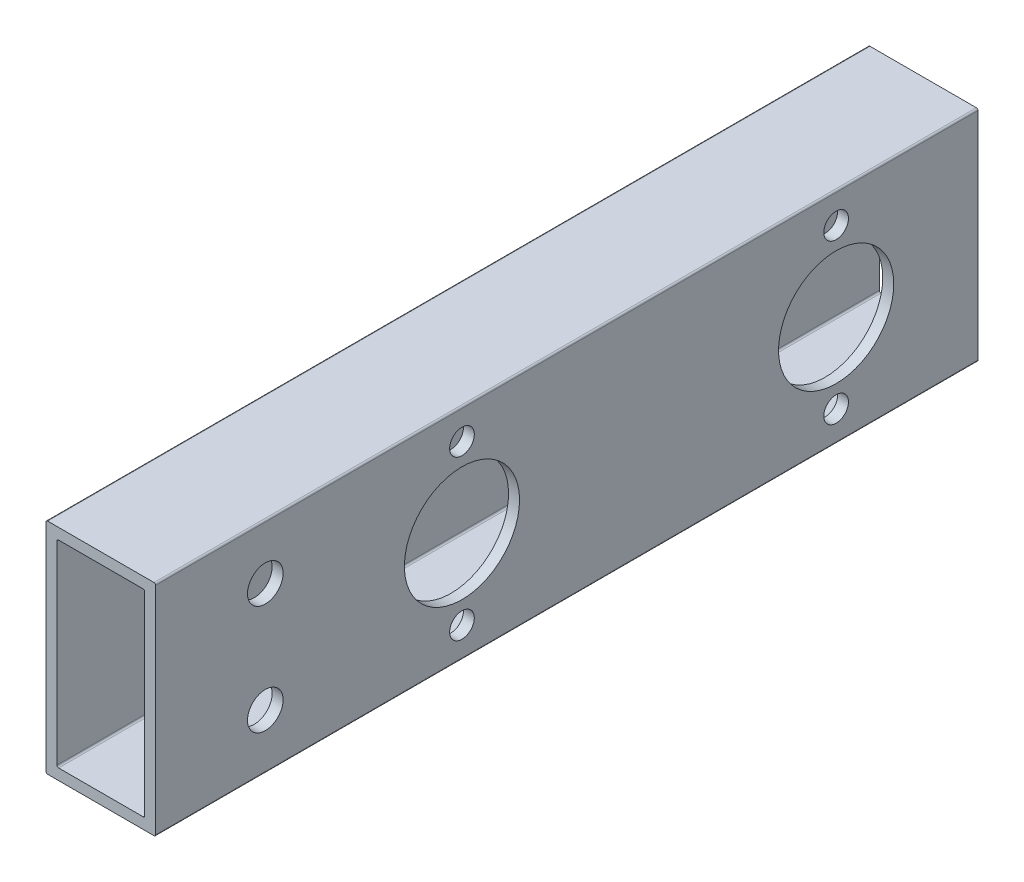
ISO-10303-21;
HEADER;
FILE_DESCRIPTION(('STEP AP214'),'2;1');
FILE_NAME('part.step','',(''),(''),'','','');
FILE_SCHEMA(('AUTOMOTIVE_DESIGN { 1 0 10303 214 1 1 1 1 }'));
ENDSEC;
DATA;
#1=APPLICATION_CONTEXT('core data for automotive mechanical design processes');
#2=APPLICATION_PROTOCOL_DEFINITION('international standard','automotive_design',2000,#1);
#3=PRODUCT_CONTEXT('',#1,'mechanical');
#4=PRODUCT('Part','Part','',(#3));
#5=PRODUCT_RELATED_PRODUCT_CATEGORY('part','',(#4));
#6=PRODUCT_DEFINITION_FORMATION('','',#4);
#7=PRODUCT_DEFINITION_CONTEXT('part definition',#1,'design');
#8=PRODUCT_DEFINITION('design','',#6,#7);
#9=PRODUCT_DEFINITION_SHAPE('','',#8);
#10=(LENGTH_UNIT() NAMED_UNIT(*) SI_UNIT(.MILLI.,.METRE.));
#11=(NAMED_UNIT(*) PLANE_ANGLE_UNIT() SI_UNIT($,.RADIAN.));
#12=(NAMED_UNIT(*) SI_UNIT($,.STERADIAN.) SOLID_ANGLE_UNIT());
#13=UNCERTAINTY_MEASURE_WITH_UNIT(LENGTH_MEASURE(1.E-05),#10,'distance_accuracy_value','');
#14=(GEOMETRIC_REPRESENTATION_CONTEXT(3) GLOBAL_UNCERTAINTY_ASSIGNED_CONTEXT((#13)) GLOBAL_UNIT_ASSIGNED_CONTEXT((#10,
#11,#12)) REPRESENTATION_CONTEXT('',''));
#15=CARTESIAN_POINT('',(0.,0.,0.));
#16=DIRECTION('',(0.,0.,1.));
#17=DIRECTION('',(1.,0.,0.));
#18=AXIS2_PLACEMENT_3D('',#15,#16,#17);
#19=CARTESIAN_POINT('',(0.300000000000001,0.300000000000001,-150.));
#20=DIRECTION('',(0.,0.,1.));
#21=DIRECTION('',(1.,0.,0.));
#22=AXIS2_PLACEMENT_3D('',#19,#20,#21);
#23=CYLINDRICAL_SURFACE('',#22,0.300000000000001);
#24=CARTESIAN_POINT('',(0.300000000000001,0.300000000000001,0.));
#25=DIRECTION('',(0.,0.,1.));
#26=DIRECTION('',(1.,0.,0.));
#27=AXIS2_PLACEMENT_3D('',#24,#25,#26);
#28=CIRCLE('',#27,0.300000000000001);
#29=CARTESIAN_POINT('',(0.,0.3,0.));
#30=VERTEX_POINT('',#29);
#31=CARTESIAN_POINT('',(0.3,0.,0.));
#32=VERTEX_POINT('',#31);
#33=EDGE_CURVE('E206',#30,#32,#28,.T.);
#34=ORIENTED_EDGE('',*,*,#33,.F.);
#35=DIRECTION('',(0.,0.,1.));
#36=VECTOR('',#35,1.);
#37=CARTESIAN_POINT('',(0.,0.3,-150.));
#38=LINE('',#37,#36);
#39=CARTESIAN_POINT('',(0.,0.3,-150.));
#40=VERTEX_POINT('',#39);
#41=EDGE_CURVE('E11',#40,#30,#38,.T.);
#42=ORIENTED_EDGE('',*,*,#41,.F.);
#43=CARTESIAN_POINT('',(0.300000000000001,0.300000000000001,-150.));
#44=DIRECTION('',(0.,0.,1.));
#45=DIRECTION('',(1.,0.,0.));
#46=AXIS2_PLACEMENT_3D('',#43,#44,#45);
#47=CIRCLE('',#46,0.300000000000001);
#48=CARTESIAN_POINT('',(0.3,0.,-150.));
#49=VERTEX_POINT('',#48);
#50=EDGE_CURVE('E218',#40,#49,#47,.T.);
#51=ORIENTED_EDGE('',*,*,#50,.T.);
#52=DIRECTION('',(0.,0.,1.));
#53=VECTOR('',#52,1.);
#54=CARTESIAN_POINT('',(0.3,0.,-150.));
#55=LINE('',#54,#53);
#56=EDGE_CURVE('E243',#49,#32,#55,.T.);
#57=ORIENTED_EDGE('',*,*,#56,.T.);
#58=EDGE_LOOP('',(#34,#42,#51,#57));
#59=FACE_BOUND('',#58,.T.);
#60=ADVANCED_FACE('F33',(#59),#23,.T.);
#61=CARTESIAN_POINT('',(0.,39.7,-150.));
#62=DIRECTION('',(-1.,0.,0.));
#63=DIRECTION('',(0.,0.,1.));
#64=AXIS2_PLACEMENT_3D('',#61,#62,#63);
#65=PLANE('',#64);
#66=CARTESIAN_POINT('',(0.,20.,-55.875));
#67=DIRECTION('',(1.,0.,0.));
#68=DIRECTION('',(0.,0.,-1.));
#69=AXIS2_PLACEMENT_3D('',#66,#67,#68);
#70=CIRCLE('',#69,10.5);
#71=CARTESIAN_POINT('',(0.,20.,-66.375));
#72=VERTEX_POINT('',#71);
#73=EDGE_CURVE('E296',#72,#72,#70,.T.);
#74=ORIENTED_EDGE('',*,*,#73,.T.);
#75=EDGE_LOOP('',(#74));
#76=FACE_BOUND('',#75,.T.);
#77=CARTESIAN_POINT('',(0.,20.,-124.125));
#78=DIRECTION('',(1.,0.,0.));
#79=DIRECTION('',(0.,0.,-1.));
#80=AXIS2_PLACEMENT_3D('',#77,#78,#79);
#81=CIRCLE('',#80,10.5);
#82=CARTESIAN_POINT('',(0.,20.,-134.625));
#83=VERTEX_POINT('',#82);
#84=EDGE_CURVE('E291',#83,#83,#81,.T.);
#85=ORIENTED_EDGE('',*,*,#84,.T.);
#86=EDGE_LOOP('',(#85));
#87=FACE_BOUND('',#86,.T.);
#88=CARTESIAN_POINT('',(0.,10.,-20.));
#89=DIRECTION('',(-1.,0.,0.));
#90=DIRECTION('',(0.,0.,1.));
#91=AXIS2_PLACEMENT_3D('',#88,#89,#90);
#92=CIRCLE('',#91,3.25);
#93=CARTESIAN_POINT('',(0.,10.,-16.75));
#94=VERTEX_POINT('',#93);
#95=EDGE_CURVE('E335',#94,#94,#92,.T.);
#96=ORIENTED_EDGE('',*,*,#95,.F.);
#97=EDGE_LOOP('',(#96));
#98=FACE_BOUND('',#97,.T.);
#99=CARTESIAN_POINT('',(0.,30.,-20.));
#100=DIRECTION('',(-1.,0.,0.));
#101=DIRECTION('',(0.,0.,1.));
#102=AXIS2_PLACEMENT_3D('',#99,#100,#101);
#103=CIRCLE('',#102,3.25);
#104=CARTESIAN_POINT('',(0.,30.,-16.75));
#105=VERTEX_POINT('',#104);
#106=EDGE_CURVE('E342',#105,#105,#103,.T.);
#107=ORIENTED_EDGE('',*,*,#106,.F.);
#108=EDGE_LOOP('',(#107));
#109=FACE_BOUND('',#108,.T.);
#110=DIRECTION('',(0.,-1.,0.));
#111=VECTOR('',#110,1.);
#112=CARTESIAN_POINT('',(0.,39.7,0.));
#113=LINE('',#112,#111);
#114=CARTESIAN_POINT('',(0.,39.7,0.));
#115=VERTEX_POINT('',#114);
#116=EDGE_CURVE('E222',#115,#30,#113,.T.);
#117=ORIENTED_EDGE('',*,*,#116,.F.);
#118=DIRECTION('',(0.,0.,1.));
#119=VECTOR('',#118,1.);
#120=CARTESIAN_POINT('',(0.,39.7,-150.));
#121=LINE('',#120,#119);
#122=CARTESIAN_POINT('',(0.,39.7,-150.));
#123=VERTEX_POINT('',#122);
#124=EDGE_CURVE('E41',#123,#115,#121,.T.);
#125=ORIENTED_EDGE('',*,*,#124,.F.);
#126=DIRECTION('',(0.,-1.,0.));
#127=VECTOR('',#126,1.);
#128=CARTESIAN_POINT('',(0.,39.7,-150.));
#129=LINE('',#128,#127);
#130=EDGE_CURVE('E240',#123,#40,#129,.T.);
#131=ORIENTED_EDGE('',*,*,#130,.T.);
#132=ORIENTED_EDGE('',*,*,#41,.T.);
#133=EDGE_LOOP('',(#117,#125,#131,#132));
#134=FACE_BOUND('',#133,.T.);
#135=ADVANCED_FACE('F350',(#76,#87,#98,#109,#134),#65,.T.);
#136=CARTESIAN_POINT('',(0.299999999999942,39.7000000000001,-150.));
#137=DIRECTION('',(0.,0.,1.));
#138=DIRECTION('',(1.,0.,0.));
#139=AXIS2_PLACEMENT_3D('',#136,#137,#138);
#140=CYLINDRICAL_SURFACE('',#139,0.299999999999944);
#141=CARTESIAN_POINT('',(0.299999999999942,39.7000000000001,0.));
#142=DIRECTION('',(0.,0.,1.));
#143=DIRECTION('',(1.,0.,0.));
#144=AXIS2_PLACEMENT_3D('',#141,#142,#143);
#145=CIRCLE('',#144,0.299999999999944);
#146=CARTESIAN_POINT('',(0.3,40.,0.));
#147=VERTEX_POINT('',#146);
#148=EDGE_CURVE('E261',#147,#115,#145,.T.);
#149=ORIENTED_EDGE('',*,*,#148,.F.);
#150=DIRECTION('',(0.,0.,1.));
#151=VECTOR('',#150,1.);
#152=CARTESIAN_POINT('',(0.3,40.,-150.));
#153=LINE('',#152,#151);
#154=CARTESIAN_POINT('',(0.3,40.,-150.));
#155=VERTEX_POINT('',#154);
#156=EDGE_CURVE('E267',#155,#147,#153,.T.);
#157=ORIENTED_EDGE('',*,*,#156,.F.);
#158=CARTESIAN_POINT('',(0.299999999999942,39.7000000000001,-150.));
#159=DIRECTION('',(0.,0.,1.));
#160=DIRECTION('',(1.,0.,0.));
#161=AXIS2_PLACEMENT_3D('',#158,#159,#160);
#162=CIRCLE('',#161,0.299999999999944);
#163=EDGE_CURVE('E237',#155,#123,#162,.T.);
#164=ORIENTED_EDGE('',*,*,#163,.T.);
#165=ORIENTED_EDGE('',*,*,#124,.T.);
#166=EDGE_LOOP('',(#149,#157,#164,#165));
#167=FACE_BOUND('',#166,.T.);
#168=ADVANCED_FACE('F353',(#167),#140,.T.);
#169=CARTESIAN_POINT('',(19.7,40.,-150.));
#170=DIRECTION('',(0.,1.,0.));
#171=DIRECTION('',(0.,0.,1.));
#172=AXIS2_PLACEMENT_3D('',#169,#170,#171);
#173=PLANE('',#172);
#174=DIRECTION('',(-1.,0.,0.));
#175=VECTOR('',#174,1.);
#176=CARTESIAN_POINT('',(19.7,40.,0.));
#177=LINE('',#176,#175);
#178=CARTESIAN_POINT('',(19.7,40.,0.));
#179=VERTEX_POINT('',#178);
#180=EDGE_CURVE('E258',#179,#147,#177,.T.);
#181=ORIENTED_EDGE('',*,*,#180,.F.);
#182=DIRECTION('',(0.,0.,1.));
#183=VECTOR('',#182,1.);
#184=CARTESIAN_POINT('',(19.7,40.,-150.));
#185=LINE('',#184,#183);
#186=CARTESIAN_POINT('',(19.7,40.,-150.));
#187=VERTEX_POINT('',#186);
#188=EDGE_CURVE('E269',#187,#179,#185,.T.);
#189=ORIENTED_EDGE('',*,*,#188,.F.);
#190=DIRECTION('',(-1.,0.,0.));
#191=VECTOR('',#190,1.);
#192=CARTESIAN_POINT('',(19.7,40.,-150.));
#193=LINE('',#192,#191);
#194=EDGE_CURVE('E234',#187,#155,#193,.T.);
#195=ORIENTED_EDGE('',*,*,#194,.T.);
#196=ORIENTED_EDGE('',*,*,#156,.T.);
#197=EDGE_LOOP('',(#181,#189,#195,#196));
#198=FACE_BOUND('',#197,.T.);
#199=ADVANCED_FACE('F385',(#198),#173,.T.);
#200=CARTESIAN_POINT('',(19.7000000000001,39.7000000000001,-150.));
#201=DIRECTION('',(0.,0.,1.));
#202=DIRECTION('',(1.,0.,0.));
#203=AXIS2_PLACEMENT_3D('',#200,#201,#202);
#204=CYLINDRICAL_SURFACE('',#203,0.299999999999884);
#205=CARTESIAN_POINT('',(19.7000000000001,39.7000000000001,0.));
#206=DIRECTION('',(0.,0.,1.));
#207=DIRECTION('',(1.,0.,0.));
#208=AXIS2_PLACEMENT_3D('',#205,#206,#207);
#209=CIRCLE('',#208,0.299999999999884);
#210=CARTESIAN_POINT('',(20.,39.7,0.));
#211=VERTEX_POINT('',#210);
#212=EDGE_CURVE('E255',#211,#179,#209,.T.);
#213=ORIENTED_EDGE('',*,*,#212,.F.);
#214=DIRECTION('',(0.,0.,1.));
#215=VECTOR('',#214,1.);
#216=CARTESIAN_POINT('',(20.,39.7,-150.));
#217=LINE('',#216,#215);
#218=CARTESIAN_POINT('',(20.,39.7,-150.));
#219=VERTEX_POINT('',#218);
#220=EDGE_CURVE('E271',#219,#211,#217,.T.);
#221=ORIENTED_EDGE('',*,*,#220,.F.);
#222=CARTESIAN_POINT('',(19.7000000000001,39.7000000000001,-150.));
#223=DIRECTION('',(0.,0.,1.));
#224=DIRECTION('',(1.,0.,0.));
#225=AXIS2_PLACEMENT_3D('',#222,#223,#224);
#226=CIRCLE('',#225,0.299999999999884);
#227=EDGE_CURVE('E231',#219,#187,#226,.T.);
#228=ORIENTED_EDGE('',*,*,#227,.T.);
#229=ORIENTED_EDGE('',*,*,#188,.T.);
#230=EDGE_LOOP('',(#213,#221,#228,#229));
#231=FACE_BOUND('',#230,.T.);
#232=ADVANCED_FACE('F383',(#231),#204,.T.);
#233=CARTESIAN_POINT('',(20.,0.3,-150.));
#234=DIRECTION('',(1.,0.,0.));
#235=DIRECTION('',(0.,0.,-1.));
#236=AXIS2_PLACEMENT_3D('',#233,#234,#235);
#237=PLANE('',#236);
#238=CARTESIAN_POINT('',(20.,34.5,-124.125));
#239=DIRECTION('',(1.,0.,0.));
#240=DIRECTION('',(0.,0.,-1.));
#241=AXIS2_PLACEMENT_3D('',#238,#239,#240);
#242=CIRCLE('',#241,2.24999999999999);
#243=CARTESIAN_POINT('',(20.,34.5,-126.375));
#244=VERTEX_POINT('',#243);
#245=EDGE_CURVE('E317',#244,#244,#242,.T.);
#246=ORIENTED_EDGE('',*,*,#245,.F.);
#247=EDGE_LOOP('',(#246));
#248=FACE_BOUND('',#247,.T.);
#249=CARTESIAN_POINT('',(20.,5.5,-55.875));
#250=DIRECTION('',(1.,0.,0.));
#251=DIRECTION('',(0.,0.,-1.));
#252=AXIS2_PLACEMENT_3D('',#249,#250,#251);
#253=CIRCLE('',#252,2.25);
#254=CARTESIAN_POINT('',(20.,5.5,-58.125));
#255=VERTEX_POINT('',#254);
#256=EDGE_CURVE('E307',#255,#255,#253,.T.);
#257=ORIENTED_EDGE('',*,*,#256,.F.);
#258=EDGE_LOOP('',(#257));
#259=FACE_BOUND('',#258,.T.);
#260=CARTESIAN_POINT('',(20.,34.5,-55.875));
#261=DIRECTION('',(1.,0.,0.));
#262=DIRECTION('',(0.,0.,-1.));
#263=AXIS2_PLACEMENT_3D('',#260,#261,#262);
#264=CIRCLE('',#263,2.25);
#265=CARTESIAN_POINT('',(20.,34.5,-58.125));
#266=VERTEX_POINT('',#265);
#267=EDGE_CURVE('E304',#266,#266,#264,.T.);
#268=ORIENTED_EDGE('',*,*,#267,.F.);
#269=EDGE_LOOP('',(#268));
#270=FACE_BOUND('',#269,.T.);
#271=CARTESIAN_POINT('',(20.,5.5,-124.125));
#272=DIRECTION('',(1.,0.,0.));
#273=DIRECTION('',(0.,0.,-1.));
#274=AXIS2_PLACEMENT_3D('',#271,#272,#273);
#275=CIRCLE('',#274,2.25000000000002);
#276=CARTESIAN_POINT('',(20.,5.5,-126.375));
#277=VERTEX_POINT('',#276);
#278=EDGE_CURVE('E301',#277,#277,#275,.T.);
#279=ORIENTED_EDGE('',*,*,#278,.F.);
#280=EDGE_LOOP('',(#279));
#281=FACE_BOUND('',#280,.T.);
#282=CARTESIAN_POINT('',(20.,20.,-55.875));
#283=DIRECTION('',(1.,0.,0.));
#284=DIRECTION('',(0.,0.,-1.));
#285=AXIS2_PLACEMENT_3D('',#282,#283,#284);
#286=CIRCLE('',#285,10.5);
#287=CARTESIAN_POINT('',(20.,20.,-66.375));
#288=VERTEX_POINT('',#287);
#289=EDGE_CURVE('E300',#288,#288,#286,.T.);
#290=ORIENTED_EDGE('',*,*,#289,.F.);
#291=EDGE_LOOP('',(#290));
#292=FACE_BOUND('',#291,.T.);
#293=CARTESIAN_POINT('',(20.,20.,-124.125));
#294=DIRECTION('',(1.,0.,0.));
#295=DIRECTION('',(0.,0.,-1.));
#296=AXIS2_PLACEMENT_3D('',#293,#294,#295);
#297=CIRCLE('',#296,10.5);
#298=CARTESIAN_POINT('',(20.,20.,-134.625));
#299=VERTEX_POINT('',#298);
#300=EDGE_CURVE('E328',#299,#299,#297,.T.);
#301=ORIENTED_EDGE('',*,*,#300,.F.);
#302=EDGE_LOOP('',(#301));
#303=FACE_BOUND('',#302,.T.);
#304=CARTESIAN_POINT('',(20.,10.,-20.));
#305=DIRECTION('',(-1.,0.,0.));
#306=DIRECTION('',(0.,0.,1.));
#307=AXIS2_PLACEMENT_3D('',#304,#305,#306);
#308=CIRCLE('',#307,3.25);
#309=CARTESIAN_POINT('',(20.,10.,-16.75));
#310=VERTEX_POINT('',#309);
#311=EDGE_CURVE('E286',#310,#310,#308,.T.);
#312=ORIENTED_EDGE('',*,*,#311,.T.);
#313=EDGE_LOOP('',(#312));
#314=FACE_BOUND('',#313,.T.);
#315=CARTESIAN_POINT('',(20.,30.,-20.));
#316=DIRECTION('',(-1.,0.,0.));
#317=DIRECTION('',(0.,0.,1.));
#318=AXIS2_PLACEMENT_3D('',#315,#316,#317);
#319=CIRCLE('',#318,3.25);
#320=CARTESIAN_POINT('',(20.,30.,-16.75));
#321=VERTEX_POINT('',#320);
#322=EDGE_CURVE('E281',#321,#321,#319,.T.);
#323=ORIENTED_EDGE('',*,*,#322,.T.);
#324=EDGE_LOOP('',(#323));
#325=FACE_BOUND('',#324,.T.);
#326=DIRECTION('',(0.,1.,0.));
#327=VECTOR('',#326,1.);
#328=CARTESIAN_POINT('',(20.,0.3,0.));
#329=LINE('',#328,#327);
#330=CARTESIAN_POINT('',(20.,0.3,0.));
#331=VERTEX_POINT('',#330);
#332=EDGE_CURVE('E252',#331,#211,#329,.T.);
#333=ORIENTED_EDGE('',*,*,#332,.F.);
#334=DIRECTION('',(0.,0.,1.));
#335=VECTOR('',#334,1.);
#336=CARTESIAN_POINT('',(20.,0.3,-150.));
#337=LINE('',#336,#335);
#338=CARTESIAN_POINT('',(20.,0.3,-150.));
#339=VERTEX_POINT('',#338);
#340=EDGE_CURVE('E273',#339,#331,#337,.T.);
#341=ORIENTED_EDGE('',*,*,#340,.F.);
#342=DIRECTION('',(0.,1.,0.));
#343=VECTOR('',#342,1.);
#344=CARTESIAN_POINT('',(20.,0.3,-150.));
#345=LINE('',#344,#343);
#346=EDGE_CURVE('E228',#339,#219,#345,.T.);
#347=ORIENTED_EDGE('',*,*,#346,.T.);
#348=ORIENTED_EDGE('',*,*,#220,.T.);
#349=EDGE_LOOP('',(#333,#341,#347,#348));
#350=FACE_BOUND('',#349,.T.);
#351=ADVANCED_FACE('F379',(#248,#259,#270,#281,#292,#303,#314,#325,#350),#237,.T.);
#352=CARTESIAN_POINT('',(19.7000000000001,0.299999999999941,-150.));
#353=DIRECTION('',(0.,0.,1.));
#354=DIRECTION('',(1.,0.,0.));
#355=AXIS2_PLACEMENT_3D('',#352,#353,#354);
#356=CYLINDRICAL_SURFACE('',#355,0.29999999999994);
#357=CARTESIAN_POINT('',(19.7000000000001,0.299999999999941,0.));
#358=DIRECTION('',(0.,0.,1.));
#359=DIRECTION('',(1.,0.,0.));
#360=AXIS2_PLACEMENT_3D('',#357,#358,#359);
#361=CIRCLE('',#360,0.29999999999994);
#362=CARTESIAN_POINT('',(19.7,0.,0.));
#363=VERTEX_POINT('',#362);
#364=EDGE_CURVE('E249',#363,#331,#361,.T.);
#365=ORIENTED_EDGE('',*,*,#364,.F.);
#366=DIRECTION('',(0.,0.,1.));
#367=VECTOR('',#366,1.);
#368=CARTESIAN_POINT('',(19.7,0.,-150.));
#369=LINE('',#368,#367);
#370=CARTESIAN_POINT('',(19.7,0.,-150.));
#371=VERTEX_POINT('',#370);
#372=EDGE_CURVE('E275',#371,#363,#369,.T.);
#373=ORIENTED_EDGE('',*,*,#372,.F.);
#374=CARTESIAN_POINT('',(19.7000000000001,0.299999999999941,-150.));
#375=DIRECTION('',(0.,0.,1.));
#376=DIRECTION('',(1.,0.,0.));
#377=AXIS2_PLACEMENT_3D('',#374,#375,#376);
#378=CIRCLE('',#377,0.29999999999994);
#379=EDGE_CURVE('E225',#371,#339,#378,.T.);
#380=ORIENTED_EDGE('',*,*,#379,.T.);
#381=ORIENTED_EDGE('',*,*,#340,.T.);
#382=EDGE_LOOP('',(#365,#373,#380,#381));
#383=FACE_BOUND('',#382,.T.);
#384=ADVANCED_FACE('F376',(#383),#356,.T.);
#385=CARTESIAN_POINT('',(0.3,0.,-150.));
#386=DIRECTION('',(0.,-1.,0.));
#387=DIRECTION('',(0.,0.,-1.));
#388=AXIS2_PLACEMENT_3D('',#385,#386,#387);
#389=PLANE('',#388);
#390=DIRECTION('',(1.,0.,0.));
#391=VECTOR('',#390,1.);
#392=CARTESIAN_POINT('',(0.3,0.,0.));
#393=LINE('',#392,#391);
#394=EDGE_CURVE('E246',#32,#363,#393,.T.);
#395=ORIENTED_EDGE('',*,*,#394,.F.);
#396=ORIENTED_EDGE('',*,*,#56,.F.);
#397=DIRECTION('',(1.,0.,0.));
#398=VECTOR('',#397,1.);
#399=CARTESIAN_POINT('',(0.3,0.,-150.));
#400=LINE('',#399,#398);
#401=EDGE_CURVE('E221',#49,#371,#400,.T.);
#402=ORIENTED_EDGE('',*,*,#401,.T.);
#403=ORIENTED_EDGE('',*,*,#372,.T.);
#404=EDGE_LOOP('',(#395,#396,#402,#403));
#405=FACE_BOUND('',#404,.T.);
#406=ADVANCED_FACE('F372',(#405),#389,.T.);
#407=CARTESIAN_POINT('',(0.300000000000001,0.300000000000001,-150.));
#408=DIRECTION('',(0.,0.,1.));
#409=DIRECTION('',(1.,0.,0.));
#410=AXIS2_PLACEMENT_3D('',#407,#408,#409);
#411=PLANE('',#410);
#412=DIRECTION('',(0.,-1.,0.));
#413=VECTOR('',#412,1.);
#414=CARTESIAN_POINT('',(2.,37.7,-150.));
#415=LINE('',#414,#413);
#416=CARTESIAN_POINT('',(2.,37.7,-150.));
#417=VERTEX_POINT('',#416);
#418=CARTESIAN_POINT('',(2.,2.3,-150.));
#419=VERTEX_POINT('',#418);
#420=EDGE_CURVE('E154',#417,#419,#415,.T.);
#421=ORIENTED_EDGE('',*,*,#420,.T.);
#422=CARTESIAN_POINT('',(2.29999999999988,2.29999999999988,-150.));
#423=DIRECTION('',(0.,0.,1.));
#424=DIRECTION('',(1.,0.,0.));
#425=AXIS2_PLACEMENT_3D('',#422,#423,#424);
#426=CIRCLE('',#425,0.299999999999877);
#427=CARTESIAN_POINT('',(2.3,2.,-150.));
#428=VERTEX_POINT('',#427);
#429=EDGE_CURVE('E148',#419,#428,#426,.T.);
#430=ORIENTED_EDGE('',*,*,#429,.T.);
#431=DIRECTION('',(1.,0.,0.));
#432=VECTOR('',#431,1.);
#433=CARTESIAN_POINT('',(2.3,2.,-150.));
#434=LINE('',#433,#432);
#435=CARTESIAN_POINT('',(17.7,2.,-150.));
#436=VERTEX_POINT('',#435);
#437=EDGE_CURVE('E157',#428,#436,#434,.T.);
#438=ORIENTED_EDGE('',*,*,#437,.T.);
#439=CARTESIAN_POINT('',(17.7000000000001,2.29999999999987,-150.));
#440=DIRECTION('',(0.,0.,1.));
#441=DIRECTION('',(1.,0.,0.));
#442=AXIS2_PLACEMENT_3D('',#439,#440,#441);
#443=CIRCLE('',#442,0.299999999999874);
#444=CARTESIAN_POINT('',(18.,2.3,-150.));
#445=VERTEX_POINT('',#444);
#446=EDGE_CURVE('E49',#436,#445,#443,.T.);
#447=ORIENTED_EDGE('',*,*,#446,.T.);
#448=DIRECTION('',(0.,1.,0.));
#449=VECTOR('',#448,1.);
#450=CARTESIAN_POINT('',(18.,2.3,-150.));
#451=LINE('',#450,#449);
#452=CARTESIAN_POINT('',(18.,37.7,-150.));
#453=VERTEX_POINT('',#452);
#454=EDGE_CURVE('E175',#445,#453,#451,.T.);
#455=ORIENTED_EDGE('',*,*,#454,.T.);
#456=CARTESIAN_POINT('',(17.7000000000001,37.7000000000001,-150.));
#457=DIRECTION('',(0.,0.,1.));
#458=DIRECTION('',(1.,0.,0.));
#459=AXIS2_PLACEMENT_3D('',#456,#457,#458);
#460=CIRCLE('',#459,0.299999999999877);
#461=CARTESIAN_POINT('',(17.7,38.,-150.));
#462=VERTEX_POINT('',#461);
#463=EDGE_CURVE('E178',#453,#462,#460,.T.);
#464=ORIENTED_EDGE('',*,*,#463,.T.);
#465=DIRECTION('',(-1.,0.,0.));
#466=VECTOR('',#465,1.);
#467=CARTESIAN_POINT('',(17.7,38.,-150.));
#468=LINE('',#467,#466);
#469=CARTESIAN_POINT('',(2.3,38.,-150.));
#470=VERTEX_POINT('',#469);
#471=EDGE_CURVE('E181',#462,#470,#468,.T.);
#472=ORIENTED_EDGE('',*,*,#471,.T.);
#473=CARTESIAN_POINT('',(2.29999999999988,37.7000000000001,-150.));
#474=DIRECTION('',(0.,0.,1.));
#475=DIRECTION('',(1.,0.,0.));
#476=AXIS2_PLACEMENT_3D('',#473,#474,#475);
#477=CIRCLE('',#476,0.299999999999882);
#478=EDGE_CURVE('E184',#470,#417,#477,.T.);
#479=ORIENTED_EDGE('',*,*,#478,.T.);
#480=EDGE_LOOP('',(#421,#430,#438,#447,#455,#464,#472,#479));
#481=FACE_BOUND('',#480,.T.);
#482=ORIENTED_EDGE('',*,*,#50,.F.);
#483=ORIENTED_EDGE('',*,*,#130,.F.);
#484=ORIENTED_EDGE('',*,*,#163,.F.);
#485=ORIENTED_EDGE('',*,*,#194,.F.);
#486=ORIENTED_EDGE('',*,*,#227,.F.);
#487=ORIENTED_EDGE('',*,*,#346,.F.);
#488=ORIENTED_EDGE('',*,*,#379,.F.);
#489=ORIENTED_EDGE('',*,*,#401,.F.);
#490=EDGE_LOOP('',(#482,#483,#484,#485,#486,#487,#488,#489));
#491=FACE_BOUND('',#490,.T.);
#492=ADVANCED_FACE('F161',(#481,#491),#411,.F.);
#493=CARTESIAN_POINT('',(0.300000000000001,0.300000000000001,0.));
#494=DIRECTION('',(0.,0.,1.));
#495=DIRECTION('',(1.,0.,0.));
#496=AXIS2_PLACEMENT_3D('',#493,#494,#495);
#497=PLANE('',#496);
#498=CARTESIAN_POINT('',(2.29999999999988,2.29999999999988,0.));
#499=DIRECTION('',(0.,0.,1.));
#500=DIRECTION('',(1.,0.,0.));
#501=AXIS2_PLACEMENT_3D('',#498,#499,#500);
#502=CIRCLE('',#501,0.299999999999877);
#503=CARTESIAN_POINT('',(2.,2.3,0.));
#504=VERTEX_POINT('',#503);
#505=CARTESIAN_POINT('',(2.3,2.,0.));
#506=VERTEX_POINT('',#505);
#507=EDGE_CURVE('E57',#504,#506,#502,.T.);
#508=ORIENTED_EDGE('',*,*,#507,.F.);
#509=DIRECTION('',(0.,-1.,0.));
#510=VECTOR('',#509,1.);
#511=CARTESIAN_POINT('',(2.,37.7,0.));
#512=LINE('',#511,#510);
#513=CARTESIAN_POINT('',(2.,37.7,0.));
#514=VERTEX_POINT('',#513);
#515=EDGE_CURVE('E165',#514,#504,#512,.T.);
#516=ORIENTED_EDGE('',*,*,#515,.F.);
#517=CARTESIAN_POINT('',(2.29999999999988,37.7000000000001,0.));
#518=DIRECTION('',(0.,0.,1.));
#519=DIRECTION('',(1.,0.,0.));
#520=AXIS2_PLACEMENT_3D('',#517,#518,#519);
#521=CIRCLE('',#520,0.299999999999882);
#522=CARTESIAN_POINT('',(2.3,38.,0.));
#523=VERTEX_POINT('',#522);
#524=EDGE_CURVE('E168',#523,#514,#521,.T.);
#525=ORIENTED_EDGE('',*,*,#524,.F.);
#526=DIRECTION('',(-1.,0.,0.));
#527=VECTOR('',#526,1.);
#528=CARTESIAN_POINT('',(17.7,38.,0.));
#529=LINE('',#528,#527);
#530=CARTESIAN_POINT('',(17.7,38.,0.));
#531=VERTEX_POINT('',#530);
#532=EDGE_CURVE('E199',#531,#523,#529,.T.);
#533=ORIENTED_EDGE('',*,*,#532,.F.);
#534=CARTESIAN_POINT('',(17.7000000000001,37.7000000000001,0.));
#535=DIRECTION('',(0.,0.,1.));
#536=DIRECTION('',(1.,0.,0.));
#537=AXIS2_PLACEMENT_3D('',#534,#535,#536);
#538=CIRCLE('',#537,0.299999999999877);
#539=CARTESIAN_POINT('',(18.,37.7,0.));
#540=VERTEX_POINT('',#539);
#541=EDGE_CURVE('E196',#540,#531,#538,.T.);
#542=ORIENTED_EDGE('',*,*,#541,.F.);
#543=DIRECTION('',(0.,1.,0.));
#544=VECTOR('',#543,1.);
#545=CARTESIAN_POINT('',(18.,2.3,0.));
#546=LINE('',#545,#544);
#547=CARTESIAN_POINT('',(18.,2.3,0.));
#548=VERTEX_POINT('',#547);
#549=EDGE_CURVE('E193',#548,#540,#546,.T.);
#550=ORIENTED_EDGE('',*,*,#549,.F.);
#551=CARTESIAN_POINT('',(17.7000000000001,2.29999999999987,0.));
#552=DIRECTION('',(0.,0.,1.));
#553=DIRECTION('',(1.,0.,0.));
#554=AXIS2_PLACEMENT_3D('',#551,#552,#553);
#555=CIRCLE('',#554,0.299999999999874);
#556=CARTESIAN_POINT('',(17.7,2.,0.));
#557=VERTEX_POINT('',#556);
#558=EDGE_CURVE('E190',#557,#548,#555,.T.);
#559=ORIENTED_EDGE('',*,*,#558,.F.);
#560=DIRECTION('',(1.,0.,0.));
#561=VECTOR('',#560,1.);
#562=CARTESIAN_POINT('',(2.3,2.,0.));
#563=LINE('',#562,#561);
#564=EDGE_CURVE('E188',#506,#557,#563,.T.);
#565=ORIENTED_EDGE('',*,*,#564,.F.);
#566=EDGE_LOOP('',(#508,#516,#525,#533,#542,#550,#559,#565));
#567=FACE_BOUND('',#566,.T.);
#568=ORIENTED_EDGE('',*,*,#33,.T.);
#569=ORIENTED_EDGE('',*,*,#394,.T.);
#570=ORIENTED_EDGE('',*,*,#364,.T.);
#571=ORIENTED_EDGE('',*,*,#332,.T.);
#572=ORIENTED_EDGE('',*,*,#212,.T.);
#573=ORIENTED_EDGE('',*,*,#180,.T.);
#574=ORIENTED_EDGE('',*,*,#148,.T.);
#575=ORIENTED_EDGE('',*,*,#116,.T.);
#576=EDGE_LOOP('',(#568,#569,#570,#571,#572,#573,#574,#575));
#577=FACE_BOUND('',#576,.T.);
#578=ADVANCED_FACE('F359',(#567,#577),#497,.T.);
#579=CARTESIAN_POINT('',(2.29999999999988,2.29999999999988,-150.));
#580=DIRECTION('',(0.,0.,1.));
#581=DIRECTION('',(1.,0.,0.));
#582=AXIS2_PLACEMENT_3D('',#579,#580,#581);
#583=CYLINDRICAL_SURFACE('',#582,0.299999999999877);
#584=ORIENTED_EDGE('',*,*,#507,.T.);
#585=DIRECTION('',(0.,0.,1.));
#586=VECTOR('',#585,1.);
#587=CARTESIAN_POINT('',(2.3,2.,-150.));
#588=LINE('',#587,#586);
#589=EDGE_CURVE('E144',#428,#506,#588,.T.);
#590=ORIENTED_EDGE('',*,*,#589,.F.);
#591=ORIENTED_EDGE('',*,*,#429,.F.);
#592=DIRECTION('',(0.,0.,1.));
#593=VECTOR('',#592,1.);
#594=CARTESIAN_POINT('',(2.,2.3,-150.));
#595=LINE('',#594,#593);
#596=EDGE_CURVE('E204',#419,#504,#595,.T.);
#597=ORIENTED_EDGE('',*,*,#596,.T.);
#598=EDGE_LOOP('',(#584,#590,#591,#597));
#599=FACE_BOUND('',#598,.T.);
#600=ADVANCED_FACE('F146',(#599),#583,.F.);
#601=CARTESIAN_POINT('',(2.,37.7,-150.));
#602=DIRECTION('',(-1.,0.,0.));
#603=DIRECTION('',(0.,0.,1.));
#604=AXIS2_PLACEMENT_3D('',#601,#602,#603);
#605=PLANE('',#604);
#606=CARTESIAN_POINT('',(2.,20.,-55.875));
#607=DIRECTION('',(-1.,0.,0.));
#608=DIRECTION('',(0.,0.,1.));
#609=AXIS2_PLACEMENT_3D('',#606,#607,#608);
#610=CIRCLE('',#609,10.5);
#611=CARTESIAN_POINT('',(2.,20.,-45.375));
#612=VERTEX_POINT('',#611);
#613=EDGE_CURVE('E295',#612,#612,#610,.T.);
#614=ORIENTED_EDGE('',*,*,#613,.T.);
#615=EDGE_LOOP('',(#614));
#616=FACE_BOUND('',#615,.T.);
#617=CARTESIAN_POINT('',(2.,20.,-124.125));
#618=DIRECTION('',(-1.,0.,0.));
#619=DIRECTION('',(0.,0.,1.));
#620=AXIS2_PLACEMENT_3D('',#617,#618,#619);
#621=CIRCLE('',#620,10.5);
#622=CARTESIAN_POINT('',(2.,20.,-113.625));
#623=VERTEX_POINT('',#622);
#624=EDGE_CURVE('E290',#623,#623,#621,.T.);
#625=ORIENTED_EDGE('',*,*,#624,.T.);
#626=EDGE_LOOP('',(#625));
#627=FACE_BOUND('',#626,.T.);
#628=CARTESIAN_POINT('',(2.,10.,-20.));
#629=DIRECTION('',(-1.,0.,0.));
#630=DIRECTION('',(0.,0.,1.));
#631=AXIS2_PLACEMENT_3D('',#628,#629,#630);
#632=CIRCLE('',#631,3.25);
#633=CARTESIAN_POINT('',(2.,10.,-16.75));
#634=VERTEX_POINT('',#633);
#635=EDGE_CURVE('E285',#634,#634,#632,.T.);
#636=ORIENTED_EDGE('',*,*,#635,.T.);
#637=EDGE_LOOP('',(#636));
#638=FACE_BOUND('',#637,.T.);
#639=CARTESIAN_POINT('',(2.,30.,-20.));
#640=DIRECTION('',(-1.,0.,0.));
#641=DIRECTION('',(0.,0.,1.));
#642=AXIS2_PLACEMENT_3D('',#639,#640,#641);
#643=CIRCLE('',#642,3.25);
#644=CARTESIAN_POINT('',(2.,30.,-16.75));
#645=VERTEX_POINT('',#644);
#646=EDGE_CURVE('E171',#645,#645,#643,.T.);
#647=ORIENTED_EDGE('',*,*,#646,.T.);
#648=EDGE_LOOP('',(#647));
#649=FACE_BOUND('',#648,.T.);
#650=ORIENTED_EDGE('',*,*,#515,.T.);
#651=ORIENTED_EDGE('',*,*,#596,.F.);
#652=ORIENTED_EDGE('',*,*,#420,.F.);
#653=DIRECTION('',(0.,0.,1.));
#654=VECTOR('',#653,1.);
#655=CARTESIAN_POINT('',(2.,37.7,-150.));
#656=LINE('',#655,#654);
#657=EDGE_CURVE('E207',#417,#514,#656,.T.);
#658=ORIENTED_EDGE('',*,*,#657,.T.);
#659=EDGE_LOOP('',(#650,#651,#652,#658));
#660=FACE_BOUND('',#659,.T.);
#661=ADVANCED_FACE('F462',(#616,#627,#638,#649,#660),#605,.F.);
#662=CARTESIAN_POINT('',(2.29999999999988,37.7000000000001,-150.));
#663=DIRECTION('',(0.,0.,1.));
#664=DIRECTION('',(1.,0.,0.));
#665=AXIS2_PLACEMENT_3D('',#662,#663,#664);
#666=CYLINDRICAL_SURFACE('',#665,0.299999999999882);
#667=ORIENTED_EDGE('',*,*,#524,.T.);
#668=ORIENTED_EDGE('',*,*,#657,.F.);
#669=ORIENTED_EDGE('',*,*,#478,.F.);
#670=DIRECTION('',(0.,0.,1.));
#671=VECTOR('',#670,1.);
#672=CARTESIAN_POINT('',(2.3,38.,-150.));
#673=LINE('',#672,#671);
#674=EDGE_CURVE('E209',#470,#523,#673,.T.);
#675=ORIENTED_EDGE('',*,*,#674,.T.);
#676=EDGE_LOOP('',(#667,#668,#669,#675));
#677=FACE_BOUND('',#676,.T.);
#678=ADVANCED_FACE('F469',(#677),#666,.F.);
#679=CARTESIAN_POINT('',(17.7,38.,-150.));
#680=DIRECTION('',(0.,1.,0.));
#681=DIRECTION('',(0.,0.,1.));
#682=AXIS2_PLACEMENT_3D('',#679,#680,#681);
#683=PLANE('',#682);
#684=ORIENTED_EDGE('',*,*,#532,.T.);
#685=ORIENTED_EDGE('',*,*,#674,.F.);
#686=ORIENTED_EDGE('',*,*,#471,.F.);
#687=DIRECTION('',(0.,0.,1.));
#688=VECTOR('',#687,1.);
#689=CARTESIAN_POINT('',(17.7,38.,-150.));
#690=LINE('',#689,#688);
#691=EDGE_CURVE('E211',#462,#531,#690,.T.);
#692=ORIENTED_EDGE('',*,*,#691,.T.);
#693=EDGE_LOOP('',(#684,#685,#686,#692));
#694=FACE_BOUND('',#693,.T.);
#695=ADVANCED_FACE('F474',(#694),#683,.F.);
#696=CARTESIAN_POINT('',(17.7000000000001,37.7000000000001,-150.));
#697=DIRECTION('',(0.,0.,1.));
#698=DIRECTION('',(1.,0.,0.));
#699=AXIS2_PLACEMENT_3D('',#696,#697,#698);
#700=CYLINDRICAL_SURFACE('',#699,0.299999999999877);
#701=ORIENTED_EDGE('',*,*,#541,.T.);
#702=ORIENTED_EDGE('',*,*,#691,.F.);
#703=ORIENTED_EDGE('',*,*,#463,.F.);
#704=DIRECTION('',(0.,0.,1.));
#705=VECTOR('',#704,1.);
#706=CARTESIAN_POINT('',(18.,37.7,-150.));
#707=LINE('',#706,#705);
#708=EDGE_CURVE('E213',#453,#540,#707,.T.);
#709=ORIENTED_EDGE('',*,*,#708,.T.);
#710=EDGE_LOOP('',(#701,#702,#703,#709));
#711=FACE_BOUND('',#710,.T.);
#712=ADVANCED_FACE('F484',(#711),#700,.F.);
#713=CARTESIAN_POINT('',(18.,2.3,-150.));
#714=DIRECTION('',(1.,0.,0.));
#715=DIRECTION('',(0.,0.,-1.));
#716=AXIS2_PLACEMENT_3D('',#713,#714,#715);
#717=PLANE('',#716);
#718=CARTESIAN_POINT('',(18.,34.5,-124.125));
#719=DIRECTION('',(1.,0.,0.));
#720=DIRECTION('',(0.,0.,-1.));
#721=AXIS2_PLACEMENT_3D('',#718,#719,#720);
#722=CIRCLE('',#721,2.24999999999999);
#723=CARTESIAN_POINT('',(18.,34.5,-126.375));
#724=VERTEX_POINT('',#723);
#725=EDGE_CURVE('E36',#724,#724,#722,.T.);
#726=ORIENTED_EDGE('',*,*,#725,.T.);
#727=EDGE_LOOP('',(#726));
#728=FACE_BOUND('',#727,.T.);
#729=CARTESIAN_POINT('',(18.,5.5,-55.875));
#730=DIRECTION('',(1.,0.,0.));
#731=DIRECTION('',(0.,0.,-1.));
#732=AXIS2_PLACEMENT_3D('',#729,#730,#731);
#733=CIRCLE('',#732,2.25);
#734=CARTESIAN_POINT('',(18.,5.5,-58.125));
#735=VERTEX_POINT('',#734);
#736=EDGE_CURVE('E305',#735,#735,#733,.T.);
#737=ORIENTED_EDGE('',*,*,#736,.T.);
#738=EDGE_LOOP('',(#737));
#739=FACE_BOUND('',#738,.T.);
#740=CARTESIAN_POINT('',(18.,34.5,-55.875));
#741=DIRECTION('',(1.,0.,0.));
#742=DIRECTION('',(0.,0.,-1.));
#743=AXIS2_PLACEMENT_3D('',#740,#741,#742);
#744=CIRCLE('',#743,2.25);
#745=CARTESIAN_POINT('',(18.,34.5,-58.125));
#746=VERTEX_POINT('',#745);
#747=EDGE_CURVE('E302',#746,#746,#744,.T.);
#748=ORIENTED_EDGE('',*,*,#747,.T.);
#749=EDGE_LOOP('',(#748));
#750=FACE_BOUND('',#749,.T.);
#751=CARTESIAN_POINT('',(18.,5.5,-124.125));
#752=DIRECTION('',(1.,0.,0.));
#753=DIRECTION('',(0.,0.,-1.));
#754=AXIS2_PLACEMENT_3D('',#751,#752,#753);
#755=CIRCLE('',#754,2.25000000000002);
#756=CARTESIAN_POINT('',(18.,5.5,-126.375));
#757=VERTEX_POINT('',#756);
#758=EDGE_CURVE('E297',#757,#757,#755,.T.);
#759=ORIENTED_EDGE('',*,*,#758,.T.);
#760=EDGE_LOOP('',(#759));
#761=FACE_BOUND('',#760,.T.);
#762=CARTESIAN_POINT('',(18.,20.,-55.875));
#763=DIRECTION('',(1.,0.,0.));
#764=DIRECTION('',(0.,0.,-1.));
#765=AXIS2_PLACEMENT_3D('',#762,#763,#764);
#766=CIRCLE('',#765,10.5);
#767=CARTESIAN_POINT('',(18.,20.,-66.375));
#768=VERTEX_POINT('',#767);
#769=EDGE_CURVE('E292',#768,#768,#766,.T.);
#770=ORIENTED_EDGE('',*,*,#769,.T.);
#771=EDGE_LOOP('',(#770));
#772=FACE_BOUND('',#771,.T.);
#773=CARTESIAN_POINT('',(18.,20.,-124.125));
#774=DIRECTION('',(1.,0.,0.));
#775=DIRECTION('',(0.,0.,-1.));
#776=AXIS2_PLACEMENT_3D('',#773,#774,#775);
#777=CIRCLE('',#776,10.5);
#778=CARTESIAN_POINT('',(18.,20.,-134.625));
#779=VERTEX_POINT('',#778);
#780=EDGE_CURVE('E287',#779,#779,#777,.T.);
#781=ORIENTED_EDGE('',*,*,#780,.T.);
#782=EDGE_LOOP('',(#781));
#783=FACE_BOUND('',#782,.T.);
#784=CARTESIAN_POINT('',(18.,10.,-20.));
#785=DIRECTION('',(1.,0.,0.));
#786=DIRECTION('',(0.,0.,-1.));
#787=AXIS2_PLACEMENT_3D('',#784,#785,#786);
#788=CIRCLE('',#787,3.25);
#789=CARTESIAN_POINT('',(18.,10.,-23.25));
#790=VERTEX_POINT('',#789);
#791=EDGE_CURVE('E282',#790,#790,#788,.T.);
#792=ORIENTED_EDGE('',*,*,#791,.T.);
#793=EDGE_LOOP('',(#792));
#794=FACE_BOUND('',#793,.T.);
#795=CARTESIAN_POINT('',(18.,30.,-20.));
#796=DIRECTION('',(1.,0.,0.));
#797=DIRECTION('',(0.,0.,-1.));
#798=AXIS2_PLACEMENT_3D('',#795,#796,#797);
#799=CIRCLE('',#798,3.25);
#800=CARTESIAN_POINT('',(18.,30.,-23.25));
#801=VERTEX_POINT('',#800);
#802=EDGE_CURVE('E278',#801,#801,#799,.T.);
#803=ORIENTED_EDGE('',*,*,#802,.T.);
#804=EDGE_LOOP('',(#803));
#805=FACE_BOUND('',#804,.T.);
#806=ORIENTED_EDGE('',*,*,#549,.T.);
#807=ORIENTED_EDGE('',*,*,#708,.F.);
#808=ORIENTED_EDGE('',*,*,#454,.F.);
#809=DIRECTION('',(0.,0.,1.));
#810=VECTOR('',#809,1.);
#811=CARTESIAN_POINT('',(18.,2.3,-150.));
#812=LINE('',#811,#810);
#813=EDGE_CURVE('E215',#445,#548,#812,.T.);
#814=ORIENTED_EDGE('',*,*,#813,.T.);
#815=EDGE_LOOP('',(#806,#807,#808,#814));
#816=FACE_BOUND('',#815,.T.);
#817=ADVANCED_FACE('F494',(#728,#739,#750,#761,#772,#783,#794,#805,#816),#717,.F.);
#818=CARTESIAN_POINT('',(17.7000000000001,2.29999999999987,-150.));
#819=DIRECTION('',(0.,0.,1.));
#820=DIRECTION('',(1.,0.,0.));
#821=AXIS2_PLACEMENT_3D('',#818,#819,#820);
#822=CYLINDRICAL_SURFACE('',#821,0.299999999999874);
#823=ORIENTED_EDGE('',*,*,#558,.T.);
#824=ORIENTED_EDGE('',*,*,#813,.F.);
#825=ORIENTED_EDGE('',*,*,#446,.F.);
#826=DIRECTION('',(0.,0.,1.));
#827=VECTOR('',#826,1.);
#828=CARTESIAN_POINT('',(17.7,2.,-150.));
#829=LINE('',#828,#827);
#830=EDGE_CURVE('E153',#436,#557,#829,.T.);
#831=ORIENTED_EDGE('',*,*,#830,.T.);
#832=EDGE_LOOP('',(#823,#824,#825,#831));
#833=FACE_BOUND('',#832,.T.);
#834=ADVANCED_FACE('F502',(#833),#822,.F.);
#835=CARTESIAN_POINT('',(2.3,2.,-150.));
#836=DIRECTION('',(0.,-1.,0.));
#837=DIRECTION('',(0.,0.,-1.));
#838=AXIS2_PLACEMENT_3D('',#835,#836,#837);
#839=PLANE('',#838);
#840=ORIENTED_EDGE('',*,*,#564,.T.);
#841=ORIENTED_EDGE('',*,*,#830,.F.);
#842=ORIENTED_EDGE('',*,*,#437,.F.);
#843=ORIENTED_EDGE('',*,*,#589,.T.);
#844=EDGE_LOOP('',(#840,#841,#842,#843));
#845=FACE_BOUND('',#844,.T.);
#846=ADVANCED_FACE('F158',(#845),#839,.F.);
#847=CARTESIAN_POINT('',(20.,30.,-20.));
#848=DIRECTION('',(-1.,0.,0.));
#849=DIRECTION('',(0.,0.,1.));
#850=AXIS2_PLACEMENT_3D('',#847,#848,#849);
#851=CYLINDRICAL_SURFACE('',#850,3.25);
#852=ORIENTED_EDGE('',*,*,#322,.F.);
#853=EDGE_LOOP('',(#852));
#854=FACE_BOUND('',#853,.T.);
#855=ORIENTED_EDGE('',*,*,#802,.F.);
#856=EDGE_LOOP('',(#855));
#857=FACE_BOUND('',#856,.T.);
#858=ADVANCED_FACE('F515',(#854,#857),#851,.F.);
#859=ORIENTED_EDGE('',*,*,#106,.T.);
#860=EDGE_LOOP('',(#859));
#861=FACE_BOUND('',#860,.T.);
#862=ORIENTED_EDGE('',*,*,#646,.F.);
#863=EDGE_LOOP('',(#862));
#864=FACE_BOUND('',#863,.T.);
#865=ADVANCED_FACE('F347',(#861,#864),#851,.F.);
#866=CARTESIAN_POINT('',(20.,10.,-20.));
#867=DIRECTION('',(-1.,0.,0.));
#868=DIRECTION('',(0.,0.,1.));
#869=AXIS2_PLACEMENT_3D('',#866,#867,#868);
#870=CYLINDRICAL_SURFACE('',#869,3.25);
#871=ORIENTED_EDGE('',*,*,#311,.F.);
#872=EDGE_LOOP('',(#871));
#873=FACE_BOUND('',#872,.T.);
#874=ORIENTED_EDGE('',*,*,#791,.F.);
#875=EDGE_LOOP('',(#874));
#876=FACE_BOUND('',#875,.T.);
#877=ADVANCED_FACE('F533',(#873,#876),#870,.F.);
#878=ORIENTED_EDGE('',*,*,#95,.T.);
#879=EDGE_LOOP('',(#878));
#880=FACE_BOUND('',#879,.T.);
#881=ORIENTED_EDGE('',*,*,#635,.F.);
#882=EDGE_LOOP('',(#881));
#883=FACE_BOUND('',#882,.T.);
#884=ADVANCED_FACE('F541',(#880,#883),#870,.F.);
#885=CARTESIAN_POINT('',(0.,20.,-124.125));
#886=DIRECTION('',(1.,0.,0.));
#887=DIRECTION('',(0.,0.,-1.));
#888=AXIS2_PLACEMENT_3D('',#885,#886,#887);
#889=CYLINDRICAL_SURFACE('',#888,10.5);
#890=ORIENTED_EDGE('',*,*,#300,.T.);
#891=EDGE_LOOP('',(#890));
#892=FACE_BOUND('',#891,.T.);
#893=ORIENTED_EDGE('',*,*,#780,.F.);
#894=EDGE_LOOP('',(#893));
#895=FACE_BOUND('',#894,.T.);
#896=ADVANCED_FACE('F551',(#892,#895),#889,.F.);
#897=ORIENTED_EDGE('',*,*,#84,.F.);
#898=EDGE_LOOP('',(#897));
#899=FACE_BOUND('',#898,.T.);
#900=ORIENTED_EDGE('',*,*,#624,.F.);
#901=EDGE_LOOP('',(#900));
#902=FACE_BOUND('',#901,.T.);
#903=ADVANCED_FACE('F559',(#899,#902),#889,.F.);
#904=CARTESIAN_POINT('',(0.,20.,-55.875));
#905=DIRECTION('',(1.,0.,0.));
#906=DIRECTION('',(0.,0.,-1.));
#907=AXIS2_PLACEMENT_3D('',#904,#905,#906);
#908=CYLINDRICAL_SURFACE('',#907,10.5);
#909=ORIENTED_EDGE('',*,*,#289,.T.);
#910=EDGE_LOOP('',(#909));
#911=FACE_BOUND('',#910,.T.);
#912=ORIENTED_EDGE('',*,*,#769,.F.);
#913=EDGE_LOOP('',(#912));
#914=FACE_BOUND('',#913,.T.);
#915=ADVANCED_FACE('F568',(#911,#914),#908,.F.);
#916=ORIENTED_EDGE('',*,*,#73,.F.);
#917=EDGE_LOOP('',(#916));
#918=FACE_BOUND('',#917,.T.);
#919=ORIENTED_EDGE('',*,*,#613,.F.);
#920=EDGE_LOOP('',(#919));
#921=FACE_BOUND('',#920,.T.);
#922=ADVANCED_FACE('F578',(#918,#921),#908,.F.);
#923=CARTESIAN_POINT('',(10.,5.5,-124.125));
#924=DIRECTION('',(1.,0.,0.));
#925=DIRECTION('',(0.,0.,-1.));
#926=AXIS2_PLACEMENT_3D('',#923,#924,#925);
#927=CYLINDRICAL_SURFACE('',#926,2.25000000000002);
#928=ORIENTED_EDGE('',*,*,#278,.T.);
#929=EDGE_LOOP('',(#928));
#930=FACE_BOUND('',#929,.T.);
#931=ORIENTED_EDGE('',*,*,#758,.F.);
#932=EDGE_LOOP('',(#931));
#933=FACE_BOUND('',#932,.T.);
#934=ADVANCED_FACE('F585',(#930,#933),#927,.F.);
#935=CARTESIAN_POINT('',(10.,34.5,-55.875));
#936=DIRECTION('',(1.,0.,0.));
#937=DIRECTION('',(0.,0.,-1.));
#938=AXIS2_PLACEMENT_3D('',#935,#936,#937);
#939=CYLINDRICAL_SURFACE('',#938,2.25);
#940=ORIENTED_EDGE('',*,*,#267,.T.);
#941=EDGE_LOOP('',(#940));
#942=FACE_BOUND('',#941,.T.);
#943=ORIENTED_EDGE('',*,*,#747,.F.);
#944=EDGE_LOOP('',(#943));
#945=FACE_BOUND('',#944,.T.);
#946=ADVANCED_FACE('F592',(#942,#945),#939,.F.);
#947=CARTESIAN_POINT('',(10.,5.5,-55.875));
#948=DIRECTION('',(1.,0.,0.));
#949=DIRECTION('',(0.,0.,-1.));
#950=AXIS2_PLACEMENT_3D('',#947,#948,#949);
#951=CYLINDRICAL_SURFACE('',#950,2.25);
#952=ORIENTED_EDGE('',*,*,#256,.T.);
#953=EDGE_LOOP('',(#952));
#954=FACE_BOUND('',#953,.T.);
#955=ORIENTED_EDGE('',*,*,#736,.F.);
#956=EDGE_LOOP('',(#955));
#957=FACE_BOUND('',#956,.T.);
#958=ADVANCED_FACE('F601',(#954,#957),#951,.F.);
#959=CARTESIAN_POINT('',(10.,34.5,-124.125));
#960=DIRECTION('',(1.,0.,0.));
#961=DIRECTION('',(0.,0.,-1.));
#962=AXIS2_PLACEMENT_3D('',#959,#960,#961);
#963=CYLINDRICAL_SURFACE('',#962,2.24999999999999);
#964=ORIENTED_EDGE('',*,*,#245,.T.);
#965=EDGE_LOOP('',(#964));
#966=FACE_BOUND('',#965,.T.);
#967=ORIENTED_EDGE('',*,*,#725,.F.);
#968=EDGE_LOOP('',(#967));
#969=FACE_BOUND('',#968,.T.);
#970=ADVANCED_FACE('F610',(#966,#969),#963,.F.);
#971=CLOSED_SHELL('',(#60,#135,#168,#199,#232,#351,#384,#406,#492,#578,#600,#661,#678,#695,#712,
#817,#834,#846,#858,#865,#877,#884,#896,#903,#915,#922,#934,#946,#958,#970));
#972=MANIFOLD_SOLID_BREP('B2',#971);
#973=ADVANCED_BREP_SHAPE_REPRESENTATION('',(#18,#972),#14);
#974=SHAPE_DEFINITION_REPRESENTATION(#9,#973);
ENDSEC;
END-ISO-10303-21;
